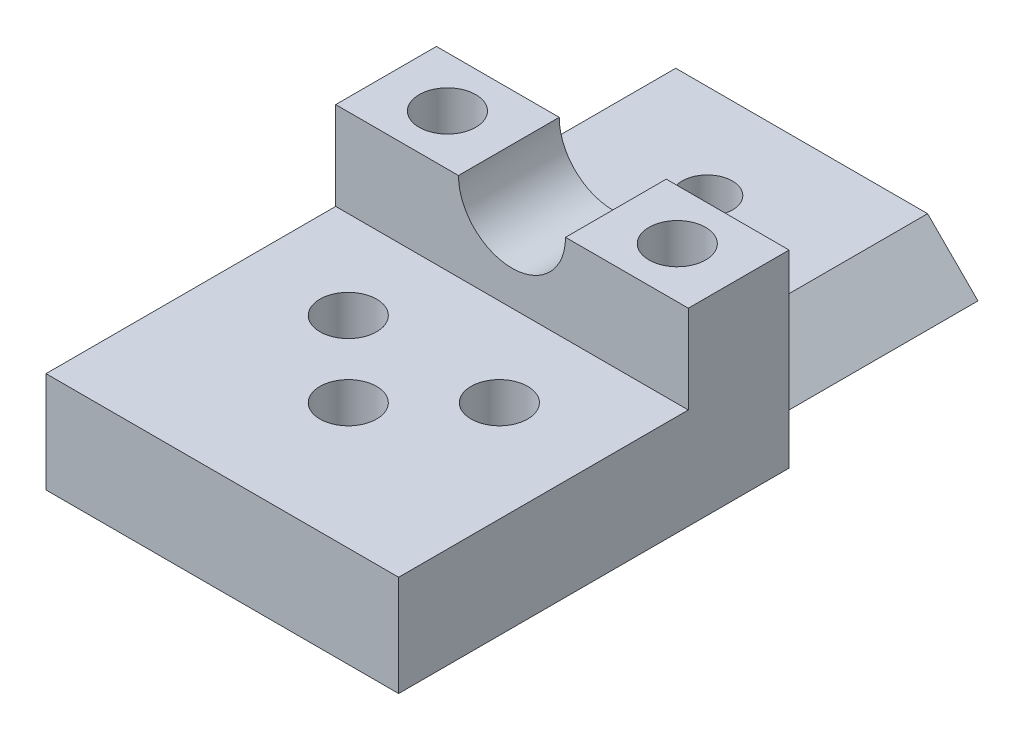
ISO-10303-21;
HEADER;
FILE_DESCRIPTION(('STEP AP214'),'2;1');
FILE_NAME('part.step','',(''),(''),'','','');
FILE_SCHEMA(('AUTOMOTIVE_DESIGN { 1 0 10303 214 1 1 1 1 }'));
ENDSEC;
DATA;
#1=APPLICATION_CONTEXT('core data for automotive mechanical design processes');
#2=APPLICATION_PROTOCOL_DEFINITION('international standard','automotive_design',2000,#1);
#3=PRODUCT_CONTEXT('',#1,'mechanical');
#4=PRODUCT('Part','Part','',(#3));
#5=PRODUCT_RELATED_PRODUCT_CATEGORY('part','',(#4));
#6=PRODUCT_DEFINITION_FORMATION('','',#4);
#7=PRODUCT_DEFINITION_CONTEXT('part definition',#1,'design');
#8=PRODUCT_DEFINITION('design','',#6,#7);
#9=PRODUCT_DEFINITION_SHAPE('','',#8);
#10=(LENGTH_UNIT() NAMED_UNIT(*) SI_UNIT(.MILLI.,.METRE.));
#11=(NAMED_UNIT(*) PLANE_ANGLE_UNIT() SI_UNIT($,.RADIAN.));
#12=(NAMED_UNIT(*) SI_UNIT($,.STERADIAN.) SOLID_ANGLE_UNIT());
#13=UNCERTAINTY_MEASURE_WITH_UNIT(LENGTH_MEASURE(1.E-05),#10,'distance_accuracy_value','');
#14=(GEOMETRIC_REPRESENTATION_CONTEXT(3) GLOBAL_UNCERTAINTY_ASSIGNED_CONTEXT((#13)) GLOBAL_UNIT_ASSIGNED_CONTEXT((#10,
#11,#12)) REPRESENTATION_CONTEXT('',''));
#15=CARTESIAN_POINT('',(0.,0.,0.));
#16=DIRECTION('',(0.,0.,1.));
#17=DIRECTION('',(1.,0.,0.));
#18=AXIS2_PLACEMENT_3D('',#15,#16,#17);
#19=CARTESIAN_POINT('',(0.,15.,0.));
#20=DIRECTION('',(0.,1.,0.));
#21=DIRECTION('',(0.,0.,1.));
#22=AXIS2_PLACEMENT_3D('',#19,#20,#21);
#23=PLANE('',#22);
#24=CARTESIAN_POINT('',(4.875,15.,-27.));
#25=DIRECTION('',(0.,1.,0.));
#26=DIRECTION('',(0.,0.,1.));
#27=AXIS2_PLACEMENT_3D('',#24,#25,#26);
#28=CIRCLE('',#27,2.25);
#29=CARTESIAN_POINT('',(4.875,15.,-24.75));
#30=VERTEX_POINT('',#29);
#31=EDGE_CURVE('E219',#30,#30,#28,.T.);
#32=ORIENTED_EDGE('',*,*,#31,.F.);
#33=EDGE_LOOP('',(#32));
#34=FACE_BOUND('',#33,.T.);
#35=DIRECTION('',(0.,0.,1.));
#36=VECTOR('',#35,1.);
#37=CARTESIAN_POINT('',(9.75,15.,-46.));
#38=LINE('',#37,#36);
#39=CARTESIAN_POINT('',(9.75,15.,-31.));
#40=VERTEX_POINT('',#39);
#41=CARTESIAN_POINT('',(9.75,15.,-23.));
#42=VERTEX_POINT('',#41);
#43=EDGE_CURVE('E177',#40,#42,#38,.T.);
#44=ORIENTED_EDGE('',*,*,#43,.F.);
#45=DIRECTION('',(-1.,0.,0.));
#46=VECTOR('',#45,1.);
#47=CARTESIAN_POINT('',(0.,15.,-31.));
#48=LINE('',#47,#46);
#49=CARTESIAN_POINT('',(0.,15.,-31.));
#50=VERTEX_POINT('',#49);
#51=EDGE_CURVE('E241',#40,#50,#48,.T.);
#52=ORIENTED_EDGE('',*,*,#51,.T.);
#53=DIRECTION('',(0.,0.,1.));
#54=VECTOR('',#53,1.);
#55=CARTESIAN_POINT('',(0.,15.,-31.));
#56=LINE('',#55,#54);
#57=CARTESIAN_POINT('',(0.,15.,-23.));
#58=VERTEX_POINT('',#57);
#59=EDGE_CURVE('E232',#50,#58,#56,.T.);
#60=ORIENTED_EDGE('',*,*,#59,.T.);
#61=DIRECTION('',(1.,0.,0.));
#62=VECTOR('',#61,1.);
#63=CARTESIAN_POINT('',(0.,15.,-23.));
#64=LINE('',#63,#62);
#65=EDGE_CURVE('E236',#58,#42,#64,.T.);
#66=ORIENTED_EDGE('',*,*,#65,.T.);
#67=EDGE_LOOP('',(#44,#52,#60,#66));
#68=FACE_BOUND('',#67,.T.);
#69=ADVANCED_FACE('F41',(#34,#68),#23,.T.);
#70=CARTESIAN_POINT('',(0.,8.,0.));
#71=DIRECTION('',(0.,-1.,0.));
#72=DIRECTION('',(0.,0.,-1.));
#73=AXIS2_PLACEMENT_3D('',#70,#71,#72);
#74=PLANE('',#73);
#75=CARTESIAN_POINT('',(14.,8.,-38.5));
#76=DIRECTION('',(0.,1.,0.));
#77=DIRECTION('',(0.,0.,1.));
#78=AXIS2_PLACEMENT_3D('',#75,#76,#77);
#79=CIRCLE('',#78,2.);
#80=CARTESIAN_POINT('',(14.,8.,-36.5));
#81=VERTEX_POINT('',#80);
#82=EDGE_CURVE('E261',#81,#81,#79,.T.);
#83=ORIENTED_EDGE('',*,*,#82,.F.);
#84=EDGE_LOOP('',(#83));
#85=FACE_BOUND('',#84,.T.);
#86=DIRECTION('',(-1.,0.,0.));
#87=VECTOR('',#86,1.);
#88=CARTESIAN_POINT('',(0.,8.,-46.));
#89=LINE('',#88,#87);
#90=CARTESIAN_POINT('',(24.,8.,-46.));
#91=VERTEX_POINT('',#90);
#92=CARTESIAN_POINT('',(4.,8.,-46.));
#93=VERTEX_POINT('',#92);
#94=EDGE_CURVE('E172',#91,#93,#89,.T.);
#95=ORIENTED_EDGE('',*,*,#94,.T.);
#96=DIRECTION('',(0.,0.,1.));
#97=VECTOR('',#96,1.);
#98=CARTESIAN_POINT('',(4.,8.,0.));
#99=LINE('',#98,#97);
#100=CARTESIAN_POINT('',(4.,8.,-31.));
#101=VERTEX_POINT('',#100);
#102=EDGE_CURVE('E186',#93,#101,#99,.T.);
#103=ORIENTED_EDGE('',*,*,#102,.T.);
#104=DIRECTION('',(-1.,0.,0.));
#105=VECTOR('',#104,1.);
#106=CARTESIAN_POINT('',(0.,8.,-31.));
#107=LINE('',#106,#105);
#108=CARTESIAN_POINT('',(24.,8.,-31.));
#109=VERTEX_POINT('',#108);
#110=EDGE_CURVE('E199',#109,#101,#107,.T.);
#111=ORIENTED_EDGE('',*,*,#110,.F.);
#112=DIRECTION('',(0.,0.,-1.));
#113=VECTOR('',#112,1.);
#114=CARTESIAN_POINT('',(24.,8.,0.));
#115=LINE('',#114,#113);
#116=EDGE_CURVE('E179',#109,#91,#115,.T.);
#117=ORIENTED_EDGE('',*,*,#116,.T.);
#118=EDGE_LOOP('',(#95,#103,#111,#117));
#119=FACE_BOUND('',#118,.T.);
#120=ADVANCED_FACE('F304',(#85,#119),#74,.F.);
#121=CARTESIAN_POINT('',(14.,8.,-10.));
#122=DIRECTION('',(0.,1.,0.));
#123=DIRECTION('',(0.,0.,1.));
#124=AXIS2_PLACEMENT_3D('',#121,#122,#123);
#125=CIRCLE('',#124,2.25);
#126=CARTESIAN_POINT('',(14.,8.,-7.75));
#127=VERTEX_POINT('',#126);
#128=EDGE_CURVE('E271',#127,#127,#125,.T.);
#129=ORIENTED_EDGE('',*,*,#128,.F.);
#130=EDGE_LOOP('',(#129));
#131=FACE_BOUND('',#130,.T.);
#132=CARTESIAN_POINT('',(19.9969834087481,8.,-16.));
#133=DIRECTION('',(0.,1.,0.));
#134=DIRECTION('',(0.,0.,1.));
#135=AXIS2_PLACEMENT_3D('',#132,#133,#134);
#136=CIRCLE('',#135,2.25);
#137=CARTESIAN_POINT('',(19.9969834087481,8.,-13.75));
#138=VERTEX_POINT('',#137);
#139=EDGE_CURVE('E265',#138,#138,#136,.T.);
#140=ORIENTED_EDGE('',*,*,#139,.F.);
#141=EDGE_LOOP('',(#140));
#142=FACE_BOUND('',#141,.T.);
#143=CARTESIAN_POINT('',(7.99999999999999,8.,-16.));
#144=DIRECTION('',(0.,1.,0.));
#145=DIRECTION('',(0.,0.,1.));
#146=AXIS2_PLACEMENT_3D('',#143,#144,#145);
#147=CIRCLE('',#146,2.25);
#148=CARTESIAN_POINT('',(7.99999999999999,8.,-13.75));
#149=VERTEX_POINT('',#148);
#150=EDGE_CURVE('E262',#149,#149,#147,.T.);
#151=ORIENTED_EDGE('',*,*,#150,.F.);
#152=EDGE_LOOP('',(#151));
#153=FACE_BOUND('',#152,.T.);
#154=DIRECTION('',(1.,0.,0.));
#155=VECTOR('',#154,1.);
#156=CARTESIAN_POINT('',(0.,8.,-23.));
#157=LINE('',#156,#155);
#158=CARTESIAN_POINT('',(0.,8.,-23.));
#159=VERTEX_POINT('',#158);
#160=CARTESIAN_POINT('',(28.,8.,-23.));
#161=VERTEX_POINT('',#160);
#162=EDGE_CURVE('E231',#159,#161,#157,.T.);
#163=ORIENTED_EDGE('',*,*,#162,.F.);
#164=DIRECTION('',(0.,0.,1.));
#165=VECTOR('',#164,1.);
#166=CARTESIAN_POINT('',(0.,8.,0.));
#167=LINE('',#166,#165);
#168=CARTESIAN_POINT('',(0.,8.,0.));
#169=VERTEX_POINT('',#168);
#170=EDGE_CURVE('E162',#159,#169,#167,.T.);
#171=ORIENTED_EDGE('',*,*,#170,.T.);
#172=DIRECTION('',(1.,0.,0.));
#173=VECTOR('',#172,1.);
#174=CARTESIAN_POINT('',(0.,8.,0.));
#175=LINE('',#174,#173);
#176=CARTESIAN_POINT('',(28.,8.,0.));
#177=VERTEX_POINT('',#176);
#178=EDGE_CURVE('E165',#169,#177,#175,.T.);
#179=ORIENTED_EDGE('',*,*,#178,.T.);
#180=DIRECTION('',(0.,0.,-1.));
#181=VECTOR('',#180,1.);
#182=CARTESIAN_POINT('',(28.,8.,0.));
#183=LINE('',#182,#181);
#184=EDGE_CURVE('E279',#177,#161,#183,.T.);
#185=ORIENTED_EDGE('',*,*,#184,.T.);
#186=EDGE_LOOP('',(#163,#171,#179,#185));
#187=FACE_BOUND('',#186,.T.);
#188=ADVANCED_FACE('F288',(#131,#142,#153,#187),#74,.F.);
#189=CARTESIAN_POINT('',(0.,0.,0.));
#190=DIRECTION('',(0.,-1.,0.));
#191=DIRECTION('',(0.,0.,-1.));
#192=AXIS2_PLACEMENT_3D('',#189,#190,#191);
#193=PLANE('',#192);
#194=DIRECTION('',(-1.,0.,0.));
#195=VECTOR('',#194,1.);
#196=CARTESIAN_POINT('',(28.,0.,-31.));
#197=LINE('',#196,#195);
#198=CARTESIAN_POINT('',(28.,0.,-31.));
#199=VERTEX_POINT('',#198);
#200=CARTESIAN_POINT('',(0.,0.,-31.));
#201=VERTEX_POINT('',#200);
#202=EDGE_CURVE('E137',#199,#201,#197,.T.);
#203=ORIENTED_EDGE('',*,*,#202,.F.);
#204=DIRECTION('',(0.,0.,-1.));
#205=VECTOR('',#204,1.);
#206=CARTESIAN_POINT('',(28.,0.,0.));
#207=LINE('',#206,#205);
#208=CARTESIAN_POINT('',(28.,0.,0.));
#209=VERTEX_POINT('',#208);
#210=EDGE_CURVE('E154',#209,#199,#207,.T.);
#211=ORIENTED_EDGE('',*,*,#210,.F.);
#212=DIRECTION('',(1.,0.,0.));
#213=VECTOR('',#212,1.);
#214=CARTESIAN_POINT('',(0.,0.,0.));
#215=LINE('',#214,#213);
#216=CARTESIAN_POINT('',(0.,0.,0.));
#217=VERTEX_POINT('',#216);
#218=EDGE_CURVE('E163',#217,#209,#215,.T.);
#219=ORIENTED_EDGE('',*,*,#218,.F.);
#220=DIRECTION('',(0.,0.,1.));
#221=VECTOR('',#220,1.);
#222=CARTESIAN_POINT('',(0.,0.,0.));
#223=LINE('',#222,#221);
#224=EDGE_CURVE('E155',#201,#217,#223,.T.);
#225=ORIENTED_EDGE('',*,*,#224,.F.);
#226=EDGE_LOOP('',(#203,#211,#219,#225));
#227=FACE_BOUND('',#226,.T.);
#228=ADVANCED_FACE('F152',(#227),#193,.T.);
#229=CARTESIAN_POINT('',(0.,8.,0.));
#230=DIRECTION('',(1.,0.,0.));
#231=DIRECTION('',(0.,0.,-1.));
#232=AXIS2_PLACEMENT_3D('',#229,#230,#231);
#233=PLANE('',#232);
#234=DIRECTION('',(0.,-1.,0.));
#235=VECTOR('',#234,1.);
#236=CARTESIAN_POINT('',(0.,15.,-31.));
#237=LINE('',#236,#235);
#238=CARTESIAN_POINT('',(0.,4.,-31.));
#239=VERTEX_POINT('',#238);
#240=EDGE_CURVE('E196',#50,#239,#237,.T.);
#241=ORIENTED_EDGE('',*,*,#240,.T.);
#242=DIRECTION('',(0.,1.,0.));
#243=VECTOR('',#242,1.);
#244=CARTESIAN_POINT('',(0.,0.,-31.));
#245=LINE('',#244,#243);
#246=EDGE_CURVE('E207',#201,#239,#245,.T.);
#247=ORIENTED_EDGE('',*,*,#246,.F.);
#248=ORIENTED_EDGE('',*,*,#224,.T.);
#249=DIRECTION('',(0.,-1.,0.));
#250=VECTOR('',#249,1.);
#251=CARTESIAN_POINT('',(0.,8.,0.));
#252=LINE('',#251,#250);
#253=EDGE_CURVE('E171',#169,#217,#252,.T.);
#254=ORIENTED_EDGE('',*,*,#253,.F.);
#255=ORIENTED_EDGE('',*,*,#170,.F.);
#256=DIRECTION('',(0.,-1.,0.));
#257=VECTOR('',#256,1.);
#258=CARTESIAN_POINT('',(0.,15.,-23.));
#259=LINE('',#258,#257);
#260=EDGE_CURVE('E254',#58,#159,#259,.T.);
#261=ORIENTED_EDGE('',*,*,#260,.F.);
#262=ORIENTED_EDGE('',*,*,#59,.F.);
#263=EDGE_LOOP('',(#241,#247,#248,#254,#255,#261,#262));
#264=FACE_BOUND('',#263,.T.);
#265=ADVANCED_FACE('F282',(#264),#233,.F.);
#266=CARTESIAN_POINT('',(0.,8.,0.));
#267=DIRECTION('',(0.,0.,-1.));
#268=DIRECTION('',(-1.,0.,0.));
#269=AXIS2_PLACEMENT_3D('',#266,#267,#268);
#270=PLANE('',#269);
#271=ORIENTED_EDGE('',*,*,#218,.T.);
#272=DIRECTION('',(0.,-1.,0.));
#273=VECTOR('',#272,1.);
#274=CARTESIAN_POINT('',(28.,8.,0.));
#275=LINE('',#274,#273);
#276=EDGE_CURVE('E161',#177,#209,#275,.T.);
#277=ORIENTED_EDGE('',*,*,#276,.F.);
#278=ORIENTED_EDGE('',*,*,#178,.F.);
#279=ORIENTED_EDGE('',*,*,#253,.T.);
#280=EDGE_LOOP('',(#271,#277,#278,#279));
#281=FACE_BOUND('',#280,.T.);
#282=ADVANCED_FACE('F286',(#281),#270,.F.);
#283=CARTESIAN_POINT('',(28.,8.,0.));
#284=DIRECTION('',(-1.,0.,0.));
#285=DIRECTION('',(0.,0.,1.));
#286=AXIS2_PLACEMENT_3D('',#283,#284,#285);
#287=PLANE('',#286);
#288=DIRECTION('',(0.,1.,0.));
#289=VECTOR('',#288,1.);
#290=CARTESIAN_POINT('',(28.,0.,-31.));
#291=LINE('',#290,#289);
#292=CARTESIAN_POINT('',(28.,4.,-31.));
#293=VERTEX_POINT('',#292);
#294=EDGE_CURVE('E133',#199,#293,#291,.T.);
#295=ORIENTED_EDGE('',*,*,#294,.T.);
#296=DIRECTION('',(0.,-1.,0.));
#297=VECTOR('',#296,1.);
#298=CARTESIAN_POINT('',(28.,15.,-31.));
#299=LINE('',#298,#297);
#300=CARTESIAN_POINT('',(28.,15.,-31.));
#301=VERTEX_POINT('',#300);
#302=EDGE_CURVE('E249',#301,#293,#299,.T.);
#303=ORIENTED_EDGE('',*,*,#302,.F.);
#304=DIRECTION('',(0.,0.,-1.));
#305=VECTOR('',#304,1.);
#306=CARTESIAN_POINT('',(28.,15.,-31.));
#307=LINE('',#306,#305);
#308=CARTESIAN_POINT('',(28.,15.,-23.));
#309=VERTEX_POINT('',#308);
#310=EDGE_CURVE('E239',#309,#301,#307,.T.);
#311=ORIENTED_EDGE('',*,*,#310,.F.);
#312=DIRECTION('',(0.,-1.,0.));
#313=VECTOR('',#312,1.);
#314=CARTESIAN_POINT('',(28.,15.,-23.));
#315=LINE('',#314,#313);
#316=EDGE_CURVE('E251',#309,#161,#315,.T.);
#317=ORIENTED_EDGE('',*,*,#316,.T.);
#318=ORIENTED_EDGE('',*,*,#184,.F.);
#319=ORIENTED_EDGE('',*,*,#276,.T.);
#320=ORIENTED_EDGE('',*,*,#210,.T.);
#321=EDGE_LOOP('',(#295,#303,#311,#317,#318,#319,#320));
#322=FACE_BOUND('',#321,.T.);
#323=ADVANCED_FACE('F158',(#322),#287,.F.);
#324=CARTESIAN_POINT('',(0.,8.,-46.));
#325=DIRECTION('',(0.,0.,1.));
#326=DIRECTION('',(1.,0.,0.));
#327=AXIS2_PLACEMENT_3D('',#324,#325,#326);
#328=PLANE('',#327);
#329=DIRECTION('',(-1.,0.,0.));
#330=VECTOR('',#329,1.);
#331=CARTESIAN_POINT('',(28.,4.,-46.));
#332=LINE('',#331,#330);
#333=CARTESIAN_POINT('',(28.,4.,-46.));
#334=VERTEX_POINT('',#333);
#335=CARTESIAN_POINT('',(0.,4.,-46.));
#336=VERTEX_POINT('',#335);
#337=EDGE_CURVE('E184',#334,#336,#332,.T.);
#338=ORIENTED_EDGE('',*,*,#337,.T.);
#339=DIRECTION('',(-0.707106781186546,-0.707106781186549,0.));
#340=VECTOR('',#339,1.);
#341=CARTESIAN_POINT('',(4.,8.,-46.));
#342=LINE('',#341,#340);
#343=EDGE_CURVE('E57',#336,#93,#342,.F.);
#344=ORIENTED_EDGE('',*,*,#343,.T.);
#345=ORIENTED_EDGE('',*,*,#94,.F.);
#346=DIRECTION('',(-0.707106781186546,0.707106781186549,0.));
#347=VECTOR('',#346,1.);
#348=CARTESIAN_POINT('',(24.,8.,-46.));
#349=LINE('',#348,#347);
#350=EDGE_CURVE('E65',#91,#334,#349,.F.);
#351=ORIENTED_EDGE('',*,*,#350,.T.);
#352=EDGE_LOOP('',(#338,#344,#345,#351));
#353=FACE_BOUND('',#352,.T.);
#354=ADVANCED_FACE('F361',(#353),#328,.F.);
#355=CARTESIAN_POINT('',(14.,8.,-38.5));
#356=DIRECTION('',(0.,-1.,0.));
#357=DIRECTION('',(0.,0.,-1.));
#358=AXIS2_PLACEMENT_3D('',#355,#356,#357);
#359=CYLINDRICAL_SURFACE('',#358,2.);
#360=CARTESIAN_POINT('',(14.,4.,-38.5));
#361=DIRECTION('',(0.,1.,0.));
#362=DIRECTION('',(0.,0.,1.));
#363=AXIS2_PLACEMENT_3D('',#360,#361,#362);
#364=CIRCLE('',#363,2.);
#365=CARTESIAN_POINT('',(14.,4.,-36.5));
#366=VERTEX_POINT('',#365);
#367=EDGE_CURVE('E180',#366,#366,#364,.T.);
#368=ORIENTED_EDGE('',*,*,#367,.F.);
#369=EDGE_LOOP('',(#368));
#370=FACE_BOUND('',#369,.T.);
#371=ORIENTED_EDGE('',*,*,#82,.T.);
#372=EDGE_LOOP('',(#371));
#373=FACE_BOUND('',#372,.T.);
#374=ADVANCED_FACE('F357',(#370,#373),#359,.F.);
#375=CARTESIAN_POINT('',(14.,4.,-10.));
#376=DIRECTION('',(0.,1.,0.));
#377=DIRECTION('',(0.,0.,1.));
#378=AXIS2_PLACEMENT_3D('',#375,#376,#377);
#379=CYLINDRICAL_SURFACE('',#378,2.25);
#380=CARTESIAN_POINT('',(14.,4.,-10.));
#381=DIRECTION('',(0.,1.,0.));
#382=DIRECTION('',(0.,0.,1.));
#383=AXIS2_PLACEMENT_3D('',#380,#381,#382);
#384=CIRCLE('',#383,2.25);
#385=CARTESIAN_POINT('',(14.,4.,-7.75));
#386=VERTEX_POINT('',#385);
#387=EDGE_CURVE('E257',#386,#386,#384,.T.);
#388=ORIENTED_EDGE('',*,*,#387,.F.);
#389=EDGE_LOOP('',(#388));
#390=FACE_BOUND('',#389,.T.);
#391=ORIENTED_EDGE('',*,*,#128,.T.);
#392=EDGE_LOOP('',(#391));
#393=FACE_BOUND('',#392,.T.);
#394=ADVANCED_FACE('F360',(#390,#393),#379,.F.);
#395=CARTESIAN_POINT('',(14.,4.,-10.));
#396=DIRECTION('',(0.,1.,0.));
#397=DIRECTION('',(0.,0.,1.));
#398=AXIS2_PLACEMENT_3D('',#395,#396,#397);
#399=PLANE('',#398);
#400=ORIENTED_EDGE('',*,*,#387,.T.);
#401=EDGE_LOOP('',(#400));
#402=FACE_BOUND('',#401,.T.);
#403=ADVANCED_FACE('F368',(#402),#399,.T.);
#404=CARTESIAN_POINT('',(19.9969834087481,4.,-16.));
#405=DIRECTION('',(0.,1.,0.));
#406=DIRECTION('',(0.,0.,1.));
#407=AXIS2_PLACEMENT_3D('',#404,#405,#406);
#408=CYLINDRICAL_SURFACE('',#407,2.25);
#409=CARTESIAN_POINT('',(19.9969834087481,4.,-16.));
#410=DIRECTION('',(0.,1.,0.));
#411=DIRECTION('',(0.,0.,1.));
#412=AXIS2_PLACEMENT_3D('',#409,#410,#411);
#413=CIRCLE('',#412,2.25);
#414=CARTESIAN_POINT('',(19.9969834087481,4.,-13.75));
#415=VERTEX_POINT('',#414);
#416=EDGE_CURVE('E268',#415,#415,#413,.T.);
#417=ORIENTED_EDGE('',*,*,#416,.F.);
#418=EDGE_LOOP('',(#417));
#419=FACE_BOUND('',#418,.T.);
#420=ORIENTED_EDGE('',*,*,#139,.T.);
#421=EDGE_LOOP('',(#420));
#422=FACE_BOUND('',#421,.T.);
#423=ADVANCED_FACE('F506',(#419,#422),#408,.F.);
#424=CARTESIAN_POINT('',(19.9969834087481,4.,-16.));
#425=DIRECTION('',(0.,1.,0.));
#426=DIRECTION('',(0.,0.,1.));
#427=AXIS2_PLACEMENT_3D('',#424,#425,#426);
#428=PLANE('',#427);
#429=ORIENTED_EDGE('',*,*,#416,.T.);
#430=EDGE_LOOP('',(#429));
#431=FACE_BOUND('',#430,.T.);
#432=ADVANCED_FACE('F514',(#431),#428,.T.);
#433=CARTESIAN_POINT('',(7.99999999999999,4.,-16.));
#434=DIRECTION('',(0.,1.,0.));
#435=DIRECTION('',(0.,0.,1.));
#436=AXIS2_PLACEMENT_3D('',#433,#434,#435);
#437=CYLINDRICAL_SURFACE('',#436,2.25);
#438=CARTESIAN_POINT('',(7.99999999999999,4.,-16.));
#439=DIRECTION('',(0.,1.,0.));
#440=DIRECTION('',(0.,0.,1.));
#441=AXIS2_PLACEMENT_3D('',#438,#439,#440);
#442=CIRCLE('',#441,2.25);
#443=CARTESIAN_POINT('',(7.99999999999999,4.,-13.75));
#444=VERTEX_POINT('',#443);
#445=EDGE_CURVE('E258',#444,#444,#442,.T.);
#446=ORIENTED_EDGE('',*,*,#445,.F.);
#447=EDGE_LOOP('',(#446));
#448=FACE_BOUND('',#447,.T.);
#449=ORIENTED_EDGE('',*,*,#150,.T.);
#450=EDGE_LOOP('',(#449));
#451=FACE_BOUND('',#450,.T.);
#452=ADVANCED_FACE('F523',(#448,#451),#437,.F.);
#453=CARTESIAN_POINT('',(7.99999999999999,4.,-16.));
#454=DIRECTION('',(0.,1.,0.));
#455=DIRECTION('',(0.,0.,1.));
#456=AXIS2_PLACEMENT_3D('',#453,#454,#455);
#457=PLANE('',#456);
#458=ORIENTED_EDGE('',*,*,#445,.T.);
#459=EDGE_LOOP('',(#458));
#460=FACE_BOUND('',#459,.T.);
#461=ADVANCED_FACE('F532',(#460),#457,.T.);
#462=CARTESIAN_POINT('',(0.,15.,-23.));
#463=DIRECTION('',(0.,0.,-1.));
#464=DIRECTION('',(-1.,0.,0.));
#465=AXIS2_PLACEMENT_3D('',#462,#463,#464);
#466=PLANE('',#465);
#467=CARTESIAN_POINT('',(18.25,15.,-23.));
#468=VERTEX_POINT('',#467);
#469=EDGE_CURVE('E235',#468,#309,#64,.T.);
#470=ORIENTED_EDGE('',*,*,#469,.F.);
#471=CARTESIAN_POINT('',(14.,15.,-23.));
#472=DIRECTION('',(0.,0.,1.));
#473=DIRECTION('',(-1.,0.,0.));
#474=AXIS2_PLACEMENT_3D('',#471,#472,#473);
#475=CIRCLE('',#474,4.25);
#476=EDGE_CURVE('E218',#42,#468,#475,.T.);
#477=ORIENTED_EDGE('',*,*,#476,.F.);
#478=ORIENTED_EDGE('',*,*,#65,.F.);
#479=ORIENTED_EDGE('',*,*,#260,.T.);
#480=ORIENTED_EDGE('',*,*,#162,.T.);
#481=ORIENTED_EDGE('',*,*,#316,.F.);
#482=EDGE_LOOP('',(#470,#477,#478,#479,#480,#481));
#483=FACE_BOUND('',#482,.T.);
#484=ADVANCED_FACE('F292',(#483),#466,.F.);
#485=CARTESIAN_POINT('',(0.,15.,-31.));
#486=DIRECTION('',(0.,0.,1.));
#487=DIRECTION('',(1.,0.,0.));
#488=AXIS2_PLACEMENT_3D('',#485,#486,#487);
#489=PLANE('',#488);
#490=ORIENTED_EDGE('',*,*,#51,.F.);
#491=CARTESIAN_POINT('',(14.,15.,-31.));
#492=DIRECTION('',(0.,0.,1.));
#493=DIRECTION('',(1.,0.,0.));
#494=AXIS2_PLACEMENT_3D('',#491,#492,#493);
#495=CIRCLE('',#494,4.25);
#496=CARTESIAN_POINT('',(18.25,15.,-31.));
#497=VERTEX_POINT('',#496);
#498=EDGE_CURVE('E228',#40,#497,#495,.T.);
#499=ORIENTED_EDGE('',*,*,#498,.T.);
#500=EDGE_CURVE('E242',#301,#497,#48,.T.);
#501=ORIENTED_EDGE('',*,*,#500,.F.);
#502=ORIENTED_EDGE('',*,*,#302,.T.);
#503=DIRECTION('',(0.707106781186546,-0.707106781186549,0.));
#504=VECTOR('',#503,1.);
#505=CARTESIAN_POINT('',(8.50000000000004,23.5,-31.));
#506=LINE('',#505,#504);
#507=EDGE_CURVE('E11',#293,#109,#506,.F.);
#508=ORIENTED_EDGE('',*,*,#507,.T.);
#509=ORIENTED_EDGE('',*,*,#110,.T.);
#510=DIRECTION('',(0.707106781186546,0.707106781186549,0.));
#511=VECTOR('',#510,1.);
#512=CARTESIAN_POINT('',(5.50000000000001,9.50000000000001,-31.));
#513=LINE('',#512,#511);
#514=EDGE_CURVE('E50',#101,#239,#513,.F.);
#515=ORIENTED_EDGE('',*,*,#514,.T.);
#516=ORIENTED_EDGE('',*,*,#240,.F.);
#517=EDGE_LOOP('',(#490,#499,#501,#502,#508,#509,#515,#516));
#518=FACE_BOUND('',#517,.T.);
#519=ADVANCED_FACE('F195',(#518),#489,.F.);
#520=CARTESIAN_POINT('',(23.125,15.,-27.));
#521=DIRECTION('',(0.,1.,0.));
#522=DIRECTION('',(0.,0.,1.));
#523=AXIS2_PLACEMENT_3D('',#520,#521,#522);
#524=CIRCLE('',#523,2.25);
#525=CARTESIAN_POINT('',(23.125,15.,-24.75));
#526=VERTEX_POINT('',#525);
#527=EDGE_CURVE('E222',#526,#526,#524,.T.);
#528=ORIENTED_EDGE('',*,*,#527,.F.);
#529=EDGE_LOOP('',(#528));
#530=FACE_BOUND('',#529,.T.);
#531=DIRECTION('',(0.,0.,1.));
#532=VECTOR('',#531,1.);
#533=CARTESIAN_POINT('',(18.25,15.,-46.));
#534=LINE('',#533,#532);
#535=EDGE_CURVE('E175',#468,#497,#534,.F.);
#536=ORIENTED_EDGE('',*,*,#535,.F.);
#537=ORIENTED_EDGE('',*,*,#469,.T.);
#538=ORIENTED_EDGE('',*,*,#310,.T.);
#539=ORIENTED_EDGE('',*,*,#500,.T.);
#540=EDGE_LOOP('',(#536,#537,#538,#539));
#541=FACE_BOUND('',#540,.T.);
#542=ADVANCED_FACE('F301',(#530,#541),#23,.T.);
#543=CARTESIAN_POINT('',(14.,15.,-46.));
#544=DIRECTION('',(0.,0.,1.));
#545=DIRECTION('',(1.,0.,0.));
#546=AXIS2_PLACEMENT_3D('',#543,#544,#545);
#547=CYLINDRICAL_SURFACE('',#546,4.25);
#548=ORIENTED_EDGE('',*,*,#43,.T.);
#549=ORIENTED_EDGE('',*,*,#476,.T.);
#550=ORIENTED_EDGE('',*,*,#535,.T.);
#551=ORIENTED_EDGE('',*,*,#498,.F.);
#552=EDGE_LOOP('',(#548,#549,#550,#551));
#553=FACE_BOUND('',#552,.T.);
#554=ADVANCED_FACE('F322',(#553),#547,.F.);
#555=CARTESIAN_POINT('',(23.125,11.,-27.));
#556=DIRECTION('',(0.,1.,0.));
#557=DIRECTION('',(0.,0.,1.));
#558=AXIS2_PLACEMENT_3D('',#555,#556,#557);
#559=CYLINDRICAL_SURFACE('',#558,2.25);
#560=CARTESIAN_POINT('',(23.125,11.,-27.));
#561=DIRECTION('',(0.,1.,0.));
#562=DIRECTION('',(0.,0.,1.));
#563=AXIS2_PLACEMENT_3D('',#560,#561,#562);
#564=CIRCLE('',#563,2.25);
#565=CARTESIAN_POINT('',(23.125,11.,-24.75));
#566=VERTEX_POINT('',#565);
#567=EDGE_CURVE('E183',#566,#566,#564,.T.);
#568=ORIENTED_EDGE('',*,*,#567,.F.);
#569=EDGE_LOOP('',(#568));
#570=FACE_BOUND('',#569,.T.);
#571=ORIENTED_EDGE('',*,*,#527,.T.);
#572=EDGE_LOOP('',(#571));
#573=FACE_BOUND('',#572,.T.);
#574=ADVANCED_FACE('F327',(#570,#573),#559,.F.);
#575=CARTESIAN_POINT('',(23.125,11.,-27.));
#576=DIRECTION('',(0.,1.,0.));
#577=DIRECTION('',(0.,0.,1.));
#578=AXIS2_PLACEMENT_3D('',#575,#576,#577);
#579=PLANE('',#578);
#580=ORIENTED_EDGE('',*,*,#567,.T.);
#581=EDGE_LOOP('',(#580));
#582=FACE_BOUND('',#581,.T.);
#583=ADVANCED_FACE('F331',(#582),#579,.T.);
#584=CARTESIAN_POINT('',(4.875,11.,-27.));
#585=DIRECTION('',(0.,1.,0.));
#586=DIRECTION('',(0.,0.,1.));
#587=AXIS2_PLACEMENT_3D('',#584,#585,#586);
#588=CYLINDRICAL_SURFACE('',#587,2.25);
#589=CARTESIAN_POINT('',(4.875,11.,-27.));
#590=DIRECTION('',(0.,1.,0.));
#591=DIRECTION('',(0.,0.,1.));
#592=AXIS2_PLACEMENT_3D('',#589,#590,#591);
#593=CIRCLE('',#592,2.25);
#594=CARTESIAN_POINT('',(4.875,11.,-24.75));
#595=VERTEX_POINT('',#594);
#596=EDGE_CURVE('E215',#595,#595,#593,.T.);
#597=ORIENTED_EDGE('',*,*,#596,.F.);
#598=EDGE_LOOP('',(#597));
#599=FACE_BOUND('',#598,.T.);
#600=ORIENTED_EDGE('',*,*,#31,.T.);
#601=EDGE_LOOP('',(#600));
#602=FACE_BOUND('',#601,.T.);
#603=ADVANCED_FACE('F337',(#599,#602),#588,.F.);
#604=CARTESIAN_POINT('',(4.875,11.,-27.));
#605=DIRECTION('',(0.,1.,0.));
#606=DIRECTION('',(0.,0.,1.));
#607=AXIS2_PLACEMENT_3D('',#604,#605,#606);
#608=PLANE('',#607);
#609=ORIENTED_EDGE('',*,*,#596,.T.);
#610=EDGE_LOOP('',(#609));
#611=FACE_BOUND('',#610,.T.);
#612=ADVANCED_FACE('F344',(#611),#608,.T.);
#613=CARTESIAN_POINT('',(28.,4.,-46.));
#614=DIRECTION('',(0.,1.,0.));
#615=DIRECTION('',(0.,0.,1.));
#616=AXIS2_PLACEMENT_3D('',#613,#614,#615);
#617=PLANE('',#616);
#618=ORIENTED_EDGE('',*,*,#367,.T.);
#619=EDGE_LOOP('',(#618));
#620=FACE_BOUND('',#619,.T.);
#621=DIRECTION('',(0.,0.,-1.));
#622=VECTOR('',#621,1.);
#623=CARTESIAN_POINT('',(0.,4.,-46.));
#624=LINE('',#623,#622);
#625=EDGE_CURVE('E147',#239,#336,#624,.T.);
#626=ORIENTED_EDGE('',*,*,#625,.T.);
#627=ORIENTED_EDGE('',*,*,#337,.F.);
#628=DIRECTION('',(0.,0.,-1.));
#629=VECTOR('',#628,1.);
#630=CARTESIAN_POINT('',(28.,4.,-46.));
#631=LINE('',#630,#629);
#632=EDGE_CURVE('E146',#293,#334,#631,.T.);
#633=ORIENTED_EDGE('',*,*,#632,.F.);
#634=DIRECTION('',(-1.,0.,0.));
#635=VECTOR('',#634,1.);
#636=CARTESIAN_POINT('',(28.,4.,-31.));
#637=LINE('',#636,#635);
#638=EDGE_CURVE('E140',#293,#239,#637,.T.);
#639=ORIENTED_EDGE('',*,*,#638,.T.);
#640=EDGE_LOOP('',(#626,#627,#633,#639));
#641=FACE_BOUND('',#640,.T.);
#642=ADVANCED_FACE('F204',(#620,#641),#617,.F.);
#643=CARTESIAN_POINT('',(28.,0.,-31.));
#644=DIRECTION('',(0.,0.,1.));
#645=DIRECTION('',(1.,0.,0.));
#646=AXIS2_PLACEMENT_3D('',#643,#644,#645);
#647=PLANE('',#646);
#648=ORIENTED_EDGE('',*,*,#246,.T.);
#649=ORIENTED_EDGE('',*,*,#638,.F.);
#650=ORIENTED_EDGE('',*,*,#294,.F.);
#651=ORIENTED_EDGE('',*,*,#202,.T.);
#652=EDGE_LOOP('',(#648,#649,#650,#651));
#653=FACE_BOUND('',#652,.T.);
#654=ADVANCED_FACE('F136',(#653),#647,.F.);
#655=CARTESIAN_POINT('',(4.,8.,0.));
#656=DIRECTION('',(0.707106781186549,-0.707106781186546,0.));
#657=DIRECTION('',(0.,0.,1.));
#658=AXIS2_PLACEMENT_3D('',#655,#656,#657);
#659=PLANE('',#658);
#660=ORIENTED_EDGE('',*,*,#343,.F.);
#661=ORIENTED_EDGE('',*,*,#625,.F.);
#662=ORIENTED_EDGE('',*,*,#514,.F.);
#663=ORIENTED_EDGE('',*,*,#102,.F.);
#664=EDGE_LOOP('',(#660,#661,#662,#663));
#665=FACE_BOUND('',#664,.T.);
#666=ADVANCED_FACE('F210',(#665),#659,.F.);
#667=CARTESIAN_POINT('',(24.,8.,0.));
#668=DIRECTION('',(-0.707106781186549,-0.707106781186546,0.));
#669=DIRECTION('',(0.,0.,-1.));
#670=AXIS2_PLACEMENT_3D('',#667,#668,#669);
#671=PLANE('',#670);
#672=ORIENTED_EDGE('',*,*,#507,.F.);
#673=ORIENTED_EDGE('',*,*,#632,.T.);
#674=ORIENTED_EDGE('',*,*,#350,.F.);
#675=ORIENTED_EDGE('',*,*,#116,.F.);
#676=EDGE_LOOP('',(#672,#673,#674,#675));
#677=FACE_BOUND('',#676,.T.);
#678=ADVANCED_FACE('F44',(#677),#671,.F.);
#679=CLOSED_SHELL('',(#69,#120,#188,#228,#265,#282,#323,#354,#374,#394,#403,#423,#432,#452,#461,
#484,#519,#542,#554,#574,#583,#603,#612,#642,#654,#666,#678));
#680=MANIFOLD_SOLID_BREP('B2',#679);
#681=ADVANCED_BREP_SHAPE_REPRESENTATION('',(#18,#680),#14);
#682=SHAPE_DEFINITION_REPRESENTATION(#9,#681);
ENDSEC;
END-ISO-10303-21;
